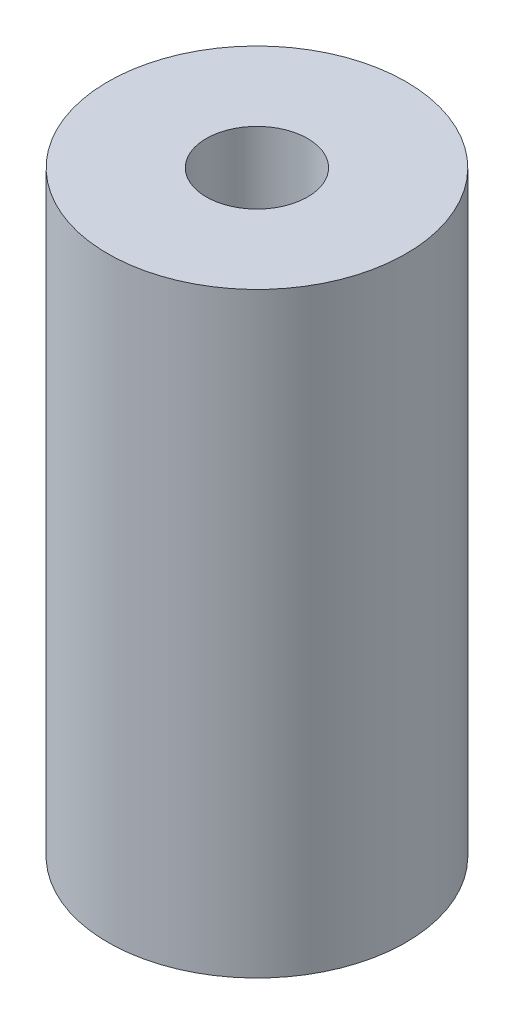
ISO-10303-21;
HEADER;
FILE_DESCRIPTION(('STEP AP214'),'2;1');
FILE_NAME('part.step','',(''),(''),'','','');
FILE_SCHEMA(('AUTOMOTIVE_DESIGN { 1 0 10303 214 1 1 1 1 }'));
ENDSEC;
DATA;
#1=APPLICATION_CONTEXT('core data for automotive mechanical design processes');
#2=APPLICATION_PROTOCOL_DEFINITION('international standard','automotive_design',2000,#1);
#3=PRODUCT_CONTEXT('',#1,'mechanical');
#4=PRODUCT('Part','Part','',(#3));
#5=PRODUCT_RELATED_PRODUCT_CATEGORY('part','',(#4));
#6=PRODUCT_DEFINITION_FORMATION('','',#4);
#7=PRODUCT_DEFINITION_CONTEXT('part definition',#1,'design');
#8=PRODUCT_DEFINITION('design','',#6,#7);
#9=PRODUCT_DEFINITION_SHAPE('','',#8);
#10=(LENGTH_UNIT() NAMED_UNIT(*) SI_UNIT(.MILLI.,.METRE.));
#11=(NAMED_UNIT(*) PLANE_ANGLE_UNIT() SI_UNIT($,.RADIAN.));
#12=(NAMED_UNIT(*) SI_UNIT($,.STERADIAN.) SOLID_ANGLE_UNIT());
#13=UNCERTAINTY_MEASURE_WITH_UNIT(LENGTH_MEASURE(1.E-05),#10,'distance_accuracy_value','');
#14=(GEOMETRIC_REPRESENTATION_CONTEXT(3) GLOBAL_UNCERTAINTY_ASSIGNED_CONTEXT((#13)) GLOBAL_UNIT_ASSIGNED_CONTEXT((#10,
#11,#12)) REPRESENTATION_CONTEXT('',''));
#15=CARTESIAN_POINT('',(0.,0.,0.));
#16=DIRECTION('',(0.,0.,1.));
#17=DIRECTION('',(1.,0.,0.));
#18=AXIS2_PLACEMENT_3D('',#15,#16,#17);
#19=CARTESIAN_POINT('',(12.5087,50.0087,12.5087));
#20=DIRECTION('',(0.,-1.,0.));
#21=DIRECTION('',(0.,0.,-1.));
#22=AXIS2_PLACEMENT_3D('',#19,#20,#21);
#23=CYLINDRICAL_SURFACE('',#22,4.25);
#24=CARTESIAN_POINT('',(12.5087,50.0087,12.5087));
#25=DIRECTION('',(0.,-1.,0.));
#26=DIRECTION('',(0.,0.,-1.));
#27=AXIS2_PLACEMENT_3D('',#24,#25,#26);
#28=CIRCLE('',#27,4.25);
#29=CARTESIAN_POINT('',(12.5087,50.0087,8.2587));
#30=VERTEX_POINT('',#29);
#31=EDGE_CURVE('E26',#30,#30,#28,.F.);
#32=ORIENTED_EDGE('',*,*,#31,.T.);
#33=EDGE_LOOP('',(#32));
#34=FACE_BOUND('',#33,.T.);
#35=CARTESIAN_POINT('',(12.5087,0.00869999999997262,12.5087));
#36=DIRECTION('',(0.,-1.,0.));
#37=DIRECTION('',(0.,0.,-1.));
#38=AXIS2_PLACEMENT_3D('',#35,#36,#37);
#39=CIRCLE('',#38,4.25);
#40=CARTESIAN_POINT('',(12.5087,0.00869999999997262,8.2587));
#41=VERTEX_POINT('',#40);
#42=EDGE_CURVE('E17',#41,#41,#39,.F.);
#43=ORIENTED_EDGE('',*,*,#42,.F.);
#44=EDGE_LOOP('',(#43));
#45=FACE_BOUND('',#44,.T.);
#46=ADVANCED_FACE('F14',(#34,#45),#23,.F.);
#47=CARTESIAN_POINT('',(12.5087,0.008699999999976,12.5087));
#48=DIRECTION('',(0.,-1.,0.));
#49=DIRECTION('',(0.,0.,-1.));
#50=AXIS2_PLACEMENT_3D('',#47,#48,#49);
#51=PLANE('',#50);
#52=ORIENTED_EDGE('',*,*,#42,.T.);
#53=EDGE_LOOP('',(#52));
#54=FACE_BOUND('',#53,.T.);
#55=CARTESIAN_POINT('',(12.5087,0.00869999999997262,12.5087));
#56=DIRECTION('',(0.,-1.,0.));
#57=DIRECTION('',(0.,0.,-1.));
#58=AXIS2_PLACEMENT_3D('',#55,#56,#57);
#59=CIRCLE('',#58,12.5);
#60=CARTESIAN_POINT('',(12.5087,0.00869999999997262,0.00869999999999864));
#61=VERTEX_POINT('',#60);
#62=EDGE_CURVE('E21',#61,#61,#59,.F.);
#63=ORIENTED_EDGE('',*,*,#62,.F.);
#64=EDGE_LOOP('',(#63));
#65=FACE_BOUND('',#64,.T.);
#66=ADVANCED_FACE('F34',(#54,#65),#51,.T.);
#67=CARTESIAN_POINT('',(12.5087,50.0087,12.5087));
#68=DIRECTION('',(0.,-1.,0.));
#69=DIRECTION('',(0.,0.,-1.));
#70=AXIS2_PLACEMENT_3D('',#67,#68,#69);
#71=PLANE('',#70);
#72=ORIENTED_EDGE('',*,*,#31,.F.);
#73=EDGE_LOOP('',(#72));
#74=FACE_BOUND('',#73,.T.);
#75=CARTESIAN_POINT('',(12.5087,50.0087,12.5087));
#76=DIRECTION('',(0.,-1.,0.));
#77=DIRECTION('',(0.,0.,-1.));
#78=AXIS2_PLACEMENT_3D('',#75,#76,#77);
#79=CIRCLE('',#78,12.5);
#80=CARTESIAN_POINT('',(12.5087,50.0087,0.00869999999999864));
#81=VERTEX_POINT('',#80);
#82=EDGE_CURVE('E10',#81,#81,#79,.T.);
#83=ORIENTED_EDGE('',*,*,#82,.F.);
#84=EDGE_LOOP('',(#83));
#85=FACE_BOUND('',#84,.T.);
#86=ADVANCED_FACE('F42',(#74,#85),#71,.F.);
#87=CARTESIAN_POINT('',(12.5087,50.0087,12.5087));
#88=DIRECTION('',(0.,-1.,0.));
#89=DIRECTION('',(0.,0.,-1.));
#90=AXIS2_PLACEMENT_3D('',#87,#88,#89);
#91=CYLINDRICAL_SURFACE('',#90,12.5);
#92=ORIENTED_EDGE('',*,*,#82,.T.);
#93=EDGE_LOOP('',(#92));
#94=FACE_BOUND('',#93,.T.);
#95=ORIENTED_EDGE('',*,*,#62,.T.);
#96=EDGE_LOOP('',(#95));
#97=FACE_BOUND('',#96,.T.);
#98=ADVANCED_FACE('F43',(#94,#97),#91,.T.);
#99=CLOSED_SHELL('',(#46,#66,#86,#98));
#100=MANIFOLD_SOLID_BREP('B1',#99);
#101=ADVANCED_BREP_SHAPE_REPRESENTATION('',(#18,#100),#14);
#102=SHAPE_DEFINITION_REPRESENTATION(#9,#101);
ENDSEC;
END-ISO-10303-21;
